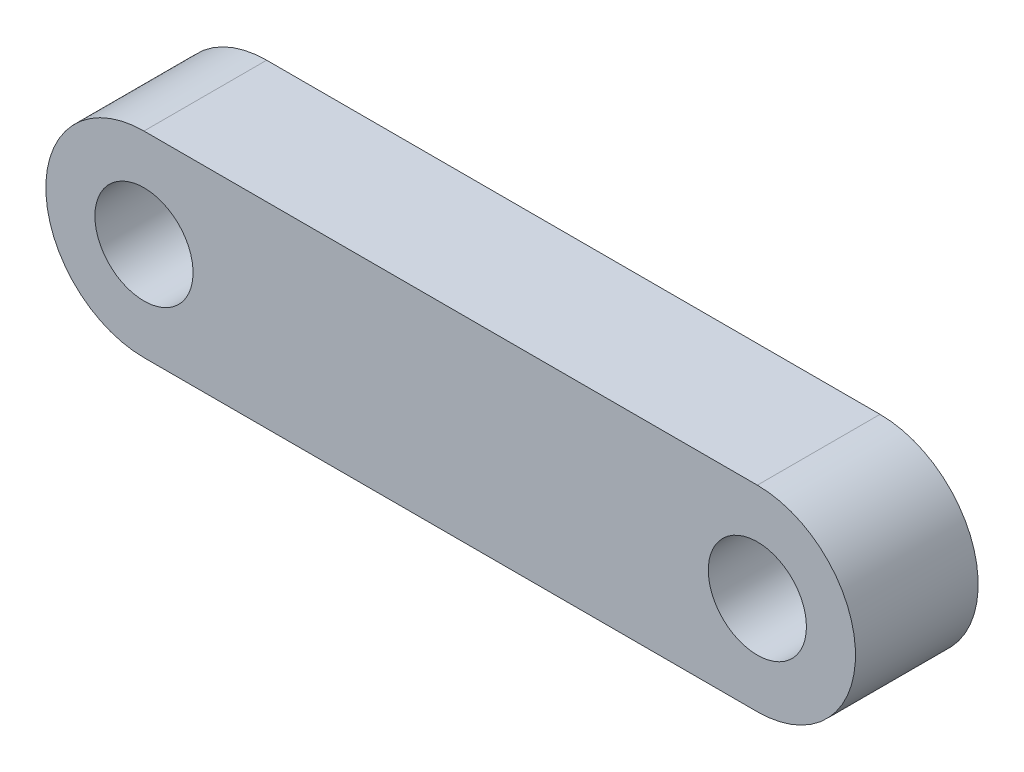
ISO-10303-21;
HEADER;
FILE_DESCRIPTION(('STEP AP214'),'2;1');
FILE_NAME('part.step','',(''),(''),'','','');
FILE_SCHEMA(('AUTOMOTIVE_DESIGN { 1 0 10303 214 1 1 1 1 }'));
ENDSEC;
DATA;
#1=APPLICATION_CONTEXT('core data for automotive mechanical design processes');
#2=APPLICATION_PROTOCOL_DEFINITION('international standard','automotive_design',2000,#1);
#3=PRODUCT_CONTEXT('',#1,'mechanical');
#4=PRODUCT('Part','Part','',(#3));
#5=PRODUCT_RELATED_PRODUCT_CATEGORY('part','',(#4));
#6=PRODUCT_DEFINITION_FORMATION('','',#4);
#7=PRODUCT_DEFINITION_CONTEXT('part definition',#1,'design');
#8=PRODUCT_DEFINITION('design','',#6,#7);
#9=PRODUCT_DEFINITION_SHAPE('','',#8);
#10=(LENGTH_UNIT() NAMED_UNIT(*) SI_UNIT(.MILLI.,.METRE.));
#11=(NAMED_UNIT(*) PLANE_ANGLE_UNIT() SI_UNIT($,.RADIAN.));
#12=(NAMED_UNIT(*) SI_UNIT($,.STERADIAN.) SOLID_ANGLE_UNIT());
#13=UNCERTAINTY_MEASURE_WITH_UNIT(LENGTH_MEASURE(1.E-05),#10,'distance_accuracy_value','');
#14=(GEOMETRIC_REPRESENTATION_CONTEXT(3) GLOBAL_UNCERTAINTY_ASSIGNED_CONTEXT((#13)) GLOBAL_UNIT_ASSIGNED_CONTEXT((#10,
#11,#12)) REPRESENTATION_CONTEXT('',''));
#15=CARTESIAN_POINT('',(0.,0.,0.));
#16=DIRECTION('',(0.,0.,1.));
#17=DIRECTION('',(1.,0.,0.));
#18=AXIS2_PLACEMENT_3D('',#15,#16,#17);
#19=CARTESIAN_POINT('',(-12.5,0.,5.));
#20=DIRECTION('',(0.,0.,1.));
#21=DIRECTION('',(1.,0.,0.));
#22=AXIS2_PLACEMENT_3D('',#19,#20,#21);
#23=PLANE('',#22);
#24=CARTESIAN_POINT('',(12.5,0.,5.));
#25=DIRECTION('',(0.,0.,1.));
#26=DIRECTION('',(1.,0.,0.));
#27=AXIS2_PLACEMENT_3D('',#24,#25,#26);
#28=CIRCLE('',#27,2.);
#29=CARTESIAN_POINT('',(14.5,0.,5.));
#30=VERTEX_POINT('',#29);
#31=EDGE_CURVE('E112',#30,#30,#28,.T.);
#32=ORIENTED_EDGE('',*,*,#31,.F.);
#33=EDGE_LOOP('',(#32));
#34=FACE_BOUND('',#33,.T.);
#35=CARTESIAN_POINT('',(-12.5,0.,5.));
#36=DIRECTION('',(0.,0.,1.));
#37=DIRECTION('',(1.,0.,0.));
#38=AXIS2_PLACEMENT_3D('',#35,#36,#37);
#39=CIRCLE('',#38,4.);
#40=CARTESIAN_POINT('',(-12.5,4.,5.));
#41=VERTEX_POINT('',#40);
#42=CARTESIAN_POINT('',(-12.5,-4.,5.));
#43=VERTEX_POINT('',#42);
#44=EDGE_CURVE('E92',#41,#43,#39,.T.);
#45=ORIENTED_EDGE('',*,*,#44,.T.);
#46=DIRECTION('',(1.,0.,0.));
#47=VECTOR('',#46,1.);
#48=CARTESIAN_POINT('',(-12.5,-4.,5.));
#49=LINE('',#48,#47);
#50=CARTESIAN_POINT('',(12.5,-4.,5.));
#51=VERTEX_POINT('',#50);
#52=EDGE_CURVE('E87',#43,#51,#49,.T.);
#53=ORIENTED_EDGE('',*,*,#52,.T.);
#54=CARTESIAN_POINT('',(12.5,0.,5.));
#55=DIRECTION('',(0.,0.,1.));
#56=DIRECTION('',(1.,0.,0.));
#57=AXIS2_PLACEMENT_3D('',#54,#55,#56);
#58=CIRCLE('',#57,4.);
#59=CARTESIAN_POINT('',(12.5,4.,5.));
#60=VERTEX_POINT('',#59);
#61=EDGE_CURVE('E90',#51,#60,#58,.T.);
#62=ORIENTED_EDGE('',*,*,#61,.T.);
#63=DIRECTION('',(-1.,0.,0.));
#64=VECTOR('',#63,1.);
#65=CARTESIAN_POINT('',(-12.5,4.,5.));
#66=LINE('',#65,#64);
#67=EDGE_CURVE('E57',#60,#41,#66,.T.);
#68=ORIENTED_EDGE('',*,*,#67,.T.);
#69=EDGE_LOOP('',(#45,#53,#62,#68));
#70=FACE_BOUND('',#69,.T.);
#71=CARTESIAN_POINT('',(-12.5,0.,5.));
#72=DIRECTION('',(0.,0.,1.));
#73=DIRECTION('',(-1.,0.,0.));
#74=AXIS2_PLACEMENT_3D('',#71,#72,#73);
#75=CIRCLE('',#74,2.00000000000001);
#76=CARTESIAN_POINT('',(-14.5,0.,5.));
#77=VERTEX_POINT('',#76);
#78=EDGE_CURVE('E134',#77,#77,#75,.T.);
#79=ORIENTED_EDGE('',*,*,#78,.F.);
#80=EDGE_LOOP('',(#79));
#81=FACE_BOUND('',#80,.T.);
#82=ADVANCED_FACE('F39',(#34,#70,#81),#23,.T.);
#83=CARTESIAN_POINT('',(-12.5,0.,0.));
#84=DIRECTION('',(0.,0.,1.));
#85=DIRECTION('',(1.,0.,0.));
#86=AXIS2_PLACEMENT_3D('',#83,#84,#85);
#87=PLANE('',#86);
#88=CARTESIAN_POINT('',(-12.5,0.,0.));
#89=DIRECTION('',(0.,0.,1.));
#90=DIRECTION('',(1.,0.,0.));
#91=AXIS2_PLACEMENT_3D('',#88,#89,#90);
#92=CIRCLE('',#91,4.);
#93=CARTESIAN_POINT('',(-12.5,4.,0.));
#94=VERTEX_POINT('',#93);
#95=CARTESIAN_POINT('',(-12.5,-4.,0.));
#96=VERTEX_POINT('',#95);
#97=EDGE_CURVE('E108',#94,#96,#92,.T.);
#98=ORIENTED_EDGE('',*,*,#97,.F.);
#99=DIRECTION('',(-1.,0.,0.));
#100=VECTOR('',#99,1.);
#101=CARTESIAN_POINT('',(-12.5,4.,0.));
#102=LINE('',#101,#100);
#103=CARTESIAN_POINT('',(12.5,4.,0.));
#104=VERTEX_POINT('',#103);
#105=EDGE_CURVE('E80',#104,#94,#102,.T.);
#106=ORIENTED_EDGE('',*,*,#105,.F.);
#107=CARTESIAN_POINT('',(12.5,0.,0.));
#108=DIRECTION('',(0.,0.,1.));
#109=DIRECTION('',(1.,0.,0.));
#110=AXIS2_PLACEMENT_3D('',#107,#108,#109);
#111=CIRCLE('',#110,4.);
#112=CARTESIAN_POINT('',(12.5,-4.,0.));
#113=VERTEX_POINT('',#112);
#114=EDGE_CURVE('E74',#113,#104,#111,.T.);
#115=ORIENTED_EDGE('',*,*,#114,.F.);
#116=DIRECTION('',(1.,0.,0.));
#117=VECTOR('',#116,1.);
#118=CARTESIAN_POINT('',(-12.5,-4.,0.));
#119=LINE('',#118,#117);
#120=EDGE_CURVE('E97',#96,#113,#119,.T.);
#121=ORIENTED_EDGE('',*,*,#120,.F.);
#122=EDGE_LOOP('',(#98,#106,#115,#121));
#123=FACE_BOUND('',#122,.T.);
#124=CARTESIAN_POINT('',(12.5,0.,0.));
#125=DIRECTION('',(0.,0.,1.));
#126=DIRECTION('',(1.,0.,0.));
#127=AXIS2_PLACEMENT_3D('',#124,#125,#126);
#128=CIRCLE('',#127,2.);
#129=CARTESIAN_POINT('',(14.5,0.,0.));
#130=VERTEX_POINT('',#129);
#131=EDGE_CURVE('E130',#130,#130,#128,.T.);
#132=ORIENTED_EDGE('',*,*,#131,.T.);
#133=EDGE_LOOP('',(#132));
#134=FACE_BOUND('',#133,.T.);
#135=CARTESIAN_POINT('',(-12.5,0.,0.));
#136=DIRECTION('',(0.,0.,1.));
#137=DIRECTION('',(-1.,0.,0.));
#138=AXIS2_PLACEMENT_3D('',#135,#136,#137);
#139=CIRCLE('',#138,2.00000000000001);
#140=CARTESIAN_POINT('',(-14.5,0.,0.));
#141=VERTEX_POINT('',#140);
#142=EDGE_CURVE('E138',#141,#141,#139,.T.);
#143=ORIENTED_EDGE('',*,*,#142,.T.);
#144=EDGE_LOOP('',(#143));
#145=FACE_BOUND('',#144,.T.);
#146=ADVANCED_FACE('F125',(#123,#134,#145),#87,.F.);
#147=CARTESIAN_POINT('',(-12.5,0.,5.));
#148=DIRECTION('',(0.,0.,-1.));
#149=DIRECTION('',(-1.,0.,0.));
#150=AXIS2_PLACEMENT_3D('',#147,#148,#149);
#151=CYLINDRICAL_SURFACE('',#150,4.);
#152=ORIENTED_EDGE('',*,*,#97,.T.);
#153=DIRECTION('',(0.,0.,-1.));
#154=VECTOR('',#153,1.);
#155=CARTESIAN_POINT('',(-12.5,-4.,5.));
#156=LINE('',#155,#154);
#157=EDGE_CURVE('E11',#43,#96,#156,.T.);
#158=ORIENTED_EDGE('',*,*,#157,.F.);
#159=ORIENTED_EDGE('',*,*,#44,.F.);
#160=DIRECTION('',(0.,0.,-1.));
#161=VECTOR('',#160,1.);
#162=CARTESIAN_POINT('',(-12.5,4.,5.));
#163=LINE('',#162,#161);
#164=EDGE_CURVE('E104',#41,#94,#163,.T.);
#165=ORIENTED_EDGE('',*,*,#164,.T.);
#166=EDGE_LOOP('',(#152,#158,#159,#165));
#167=FACE_BOUND('',#166,.T.);
#168=ADVANCED_FACE('F41',(#167),#151,.T.);
#169=CARTESIAN_POINT('',(-12.5,-4.,5.));
#170=DIRECTION('',(0.,1.,0.));
#171=DIRECTION('',(0.,0.,1.));
#172=AXIS2_PLACEMENT_3D('',#169,#170,#171);
#173=PLANE('',#172);
#174=ORIENTED_EDGE('',*,*,#120,.T.);
#175=DIRECTION('',(0.,0.,-1.));
#176=VECTOR('',#175,1.);
#177=CARTESIAN_POINT('',(12.5,-4.,5.));
#178=LINE('',#177,#176);
#179=EDGE_CURVE('E49',#51,#113,#178,.T.);
#180=ORIENTED_EDGE('',*,*,#179,.F.);
#181=ORIENTED_EDGE('',*,*,#52,.F.);
#182=ORIENTED_EDGE('',*,*,#157,.T.);
#183=EDGE_LOOP('',(#174,#180,#181,#182));
#184=FACE_BOUND('',#183,.T.);
#185=ADVANCED_FACE('F96',(#184),#173,.F.);
#186=CARTESIAN_POINT('',(12.5,0.,5.));
#187=DIRECTION('',(0.,0.,-1.));
#188=DIRECTION('',(-1.,0.,0.));
#189=AXIS2_PLACEMENT_3D('',#186,#187,#188);
#190=CYLINDRICAL_SURFACE('',#189,4.);
#191=ORIENTED_EDGE('',*,*,#114,.T.);
#192=DIRECTION('',(0.,0.,-1.));
#193=VECTOR('',#192,1.);
#194=CARTESIAN_POINT('',(12.5,4.,5.));
#195=LINE('',#194,#193);
#196=EDGE_CURVE('E99',#60,#104,#195,.T.);
#197=ORIENTED_EDGE('',*,*,#196,.F.);
#198=ORIENTED_EDGE('',*,*,#61,.F.);
#199=ORIENTED_EDGE('',*,*,#179,.T.);
#200=EDGE_LOOP('',(#191,#197,#198,#199));
#201=FACE_BOUND('',#200,.T.);
#202=ADVANCED_FACE('F100',(#201),#190,.T.);
#203=CARTESIAN_POINT('',(-12.5,4.,5.));
#204=DIRECTION('',(0.,-1.,0.));
#205=DIRECTION('',(1.,0.,0.));
#206=AXIS2_PLACEMENT_3D('',#203,#204,#205);
#207=PLANE('',#206);
#208=ORIENTED_EDGE('',*,*,#105,.T.);
#209=ORIENTED_EDGE('',*,*,#164,.F.);
#210=ORIENTED_EDGE('',*,*,#67,.F.);
#211=ORIENTED_EDGE('',*,*,#196,.T.);
#212=EDGE_LOOP('',(#208,#209,#210,#211));
#213=FACE_BOUND('',#212,.T.);
#214=ADVANCED_FACE('F122',(#213),#207,.F.);
#215=CARTESIAN_POINT('',(12.5,0.,5.));
#216=DIRECTION('',(0.,0.,-1.));
#217=DIRECTION('',(-1.,0.,0.));
#218=AXIS2_PLACEMENT_3D('',#215,#216,#217);
#219=CYLINDRICAL_SURFACE('',#218,2.);
#220=ORIENTED_EDGE('',*,*,#31,.T.);
#221=EDGE_LOOP('',(#220));
#222=FACE_BOUND('',#221,.T.);
#223=ORIENTED_EDGE('',*,*,#131,.F.);
#224=EDGE_LOOP('',(#223));
#225=FACE_BOUND('',#224,.T.);
#226=ADVANCED_FACE('F157',(#222,#225),#219,.F.);
#227=CARTESIAN_POINT('',(-12.5,0.,5.));
#228=DIRECTION('',(0.,0.,-1.));
#229=DIRECTION('',(-1.,0.,0.));
#230=AXIS2_PLACEMENT_3D('',#227,#228,#229);
#231=CYLINDRICAL_SURFACE('',#230,2.00000000000001);
#232=ORIENTED_EDGE('',*,*,#78,.T.);
#233=EDGE_LOOP('',(#232));
#234=FACE_BOUND('',#233,.T.);
#235=ORIENTED_EDGE('',*,*,#142,.F.);
#236=EDGE_LOOP('',(#235));
#237=FACE_BOUND('',#236,.T.);
#238=ADVANCED_FACE('F146',(#234,#237),#231,.F.);
#239=CLOSED_SHELL('',(#82,#146,#168,#185,#202,#214,#226,#238));
#240=MANIFOLD_SOLID_BREP('B2',#239);
#241=ADVANCED_BREP_SHAPE_REPRESENTATION('',(#18,#240),#14);
#242=SHAPE_DEFINITION_REPRESENTATION(#9,#241);
ENDSEC;
END-ISO-10303-21;
